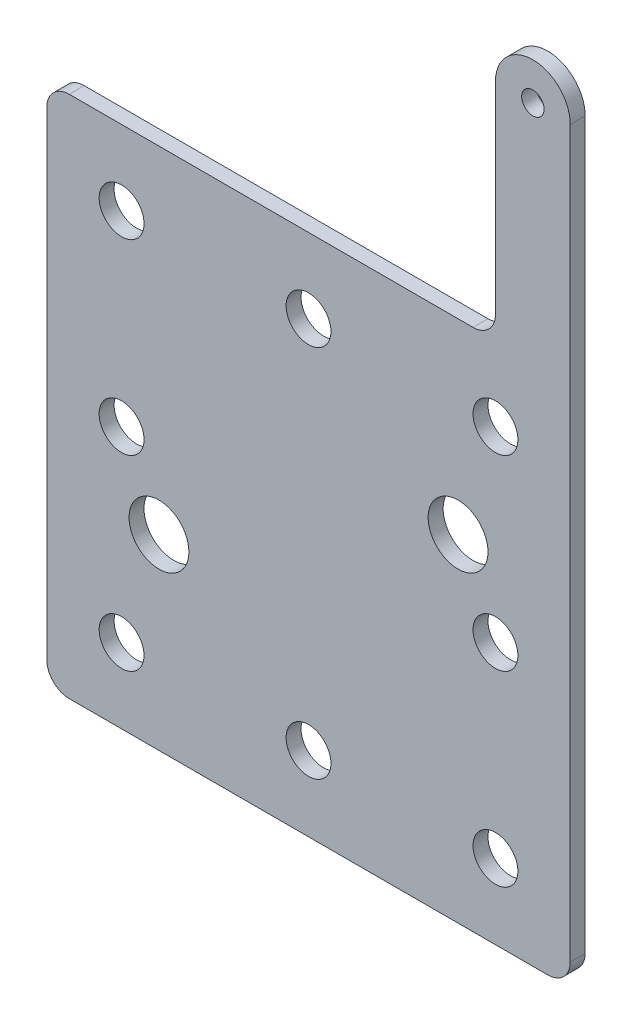
ISO-10303-21;
HEADER;
FILE_DESCRIPTION(('STEP AP214'),'2;1');
FILE_NAME('part.step','',(''),(''),'','','');
FILE_SCHEMA(('AUTOMOTIVE_DESIGN { 1 0 10303 214 1 1 1 1 }'));
ENDSEC;
DATA;
#1=APPLICATION_CONTEXT('core data for automotive mechanical design processes');
#2=APPLICATION_PROTOCOL_DEFINITION('international standard','automotive_design',2000,#1);
#3=PRODUCT_CONTEXT('',#1,'mechanical');
#4=PRODUCT('Part','Part','',(#3));
#5=PRODUCT_RELATED_PRODUCT_CATEGORY('part','',(#4));
#6=PRODUCT_DEFINITION_FORMATION('','',#4);
#7=PRODUCT_DEFINITION_CONTEXT('part definition',#1,'design');
#8=PRODUCT_DEFINITION('design','',#6,#7);
#9=PRODUCT_DEFINITION_SHAPE('','',#8);
#10=(LENGTH_UNIT() NAMED_UNIT(*) SI_UNIT(.MILLI.,.METRE.));
#11=(NAMED_UNIT(*) PLANE_ANGLE_UNIT() SI_UNIT($,.RADIAN.));
#12=(NAMED_UNIT(*) SI_UNIT($,.STERADIAN.) SOLID_ANGLE_UNIT());
#13=UNCERTAINTY_MEASURE_WITH_UNIT(LENGTH_MEASURE(1.E-05),#10,'distance_accuracy_value','');
#14=(GEOMETRIC_REPRESENTATION_CONTEXT(3) GLOBAL_UNCERTAINTY_ASSIGNED_CONTEXT((#13)) GLOBAL_UNIT_ASSIGNED_CONTEXT((#10,
#11,#12)) REPRESENTATION_CONTEXT('',''));
#15=CARTESIAN_POINT('',(0.,0.,0.));
#16=DIRECTION('',(0.,0.,1.));
#17=DIRECTION('',(1.,0.,0.));
#18=AXIS2_PLACEMENT_3D('',#15,#16,#17);
#19=CARTESIAN_POINT('',(35.,35.,2.));
#20=DIRECTION('',(-1.,0.,0.));
#21=DIRECTION('',(0.,-1.,0.));
#22=AXIS2_PLACEMENT_3D('',#19,#20,#21);
#23=PLANE('',#22);
#24=DIRECTION('',(0.,1.,0.));
#25=VECTOR('',#24,1.);
#26=CARTESIAN_POINT('',(35.,-35.,2.));
#27=LINE('',#26,#25);
#28=CARTESIAN_POINT('',(35.,-32.,2.));
#29=VERTEX_POINT('',#28);
#30=CARTESIAN_POINT('',(35.,65.,2.));
#31=VERTEX_POINT('',#30);
#32=EDGE_CURVE('E109',#29,#31,#27,.T.);
#33=ORIENTED_EDGE('',*,*,#32,.F.);
#34=DIRECTION('',(0.,0.,-1.));
#35=VECTOR('',#34,1.);
#36=CARTESIAN_POINT('',(35.,-32.,2.));
#37=LINE('',#36,#35);
#38=CARTESIAN_POINT('',(35.,-32.,0.));
#39=VERTEX_POINT('',#38);
#40=EDGE_CURVE('E200',#29,#39,#37,.T.);
#41=ORIENTED_EDGE('',*,*,#40,.T.);
#42=DIRECTION('',(0.,1.,0.));
#43=VECTOR('',#42,1.);
#44=CARTESIAN_POINT('',(35.,35.,0.));
#45=LINE('',#44,#43);
#46=CARTESIAN_POINT('',(35.,65.,0.));
#47=VERTEX_POINT('',#46);
#48=EDGE_CURVE('E127',#39,#47,#45,.T.);
#49=ORIENTED_EDGE('',*,*,#48,.T.);
#50=DIRECTION('',(0.,0.,-1.));
#51=VECTOR('',#50,1.);
#52=CARTESIAN_POINT('',(35.,65.,2.));
#53=LINE('',#52,#51);
#54=EDGE_CURVE('E125',#31,#47,#53,.T.);
#55=ORIENTED_EDGE('',*,*,#54,.F.);
#56=EDGE_LOOP('',(#33,#41,#49,#55));
#57=FACE_BOUND('',#56,.T.);
#58=ADVANCED_FACE('F33',(#57),#23,.F.);
#59=CARTESIAN_POINT('',(30.,65.,2.));
#60=DIRECTION('',(0.,0.,-1.));
#61=DIRECTION('',(-1.,0.,0.));
#62=AXIS2_PLACEMENT_3D('',#59,#60,#61);
#63=CYLINDRICAL_SURFACE('',#62,5.);
#64=CARTESIAN_POINT('',(30.,65.,0.));
#65=DIRECTION('',(0.,0.,1.));
#66=DIRECTION('',(-1.,0.,0.));
#67=AXIS2_PLACEMENT_3D('',#64,#65,#66);
#68=CIRCLE('',#67,5.);
#69=CARTESIAN_POINT('',(25.,65.,0.));
#70=VERTEX_POINT('',#69);
#71=EDGE_CURVE('E148',#47,#70,#68,.T.);
#72=ORIENTED_EDGE('',*,*,#71,.T.);
#73=DIRECTION('',(0.,0.,-1.));
#74=VECTOR('',#73,1.);
#75=CARTESIAN_POINT('',(25.,65.,2.));
#76=LINE('',#75,#74);
#77=CARTESIAN_POINT('',(25.,65.,2.));
#78=VERTEX_POINT('',#77);
#79=EDGE_CURVE('E131',#78,#70,#76,.T.);
#80=ORIENTED_EDGE('',*,*,#79,.F.);
#81=CARTESIAN_POINT('',(30.,65.,2.));
#82=DIRECTION('',(0.,0.,1.));
#83=DIRECTION('',(-1.,0.,0.));
#84=AXIS2_PLACEMENT_3D('',#81,#82,#83);
#85=CIRCLE('',#84,5.);
#86=EDGE_CURVE('E115',#31,#78,#85,.T.);
#87=ORIENTED_EDGE('',*,*,#86,.F.);
#88=ORIENTED_EDGE('',*,*,#54,.T.);
#89=EDGE_LOOP('',(#72,#80,#87,#88));
#90=FACE_BOUND('',#89,.T.);
#91=ADVANCED_FACE('F133',(#90),#63,.T.);
#92=CARTESIAN_POINT('',(25.,35.,2.));
#93=DIRECTION('',(1.,0.,0.));
#94=DIRECTION('',(0.,0.,-1.));
#95=AXIS2_PLACEMENT_3D('',#92,#93,#94);
#96=PLANE('',#95);
#97=DIRECTION('',(0.,-1.,0.));
#98=VECTOR('',#97,1.);
#99=CARTESIAN_POINT('',(25.,35.,0.));
#100=LINE('',#99,#98);
#101=CARTESIAN_POINT('',(25.,38.,0.));
#102=VERTEX_POINT('',#101);
#103=EDGE_CURVE('E151',#70,#102,#100,.T.);
#104=ORIENTED_EDGE('',*,*,#103,.T.);
#105=DIRECTION('',(0.,0.,-1.));
#106=VECTOR('',#105,1.);
#107=CARTESIAN_POINT('',(25.,38.,2.));
#108=LINE('',#107,#106);
#109=CARTESIAN_POINT('',(25.,38.,2.));
#110=VERTEX_POINT('',#109);
#111=EDGE_CURVE('E198',#102,#110,#108,.F.);
#112=ORIENTED_EDGE('',*,*,#111,.T.);
#113=DIRECTION('',(0.,-1.,0.));
#114=VECTOR('',#113,1.);
#115=CARTESIAN_POINT('',(25.,35.,2.));
#116=LINE('',#115,#114);
#117=EDGE_CURVE('E136',#78,#110,#116,.T.);
#118=ORIENTED_EDGE('',*,*,#117,.F.);
#119=ORIENTED_EDGE('',*,*,#79,.T.);
#120=EDGE_LOOP('',(#104,#112,#118,#119));
#121=FACE_BOUND('',#120,.T.);
#122=ADVANCED_FACE('F228',(#121),#96,.F.);
#123=CARTESIAN_POINT('',(-35.,35.,2.));
#124=DIRECTION('',(0.,-1.,0.));
#125=DIRECTION('',(0.,0.,-1.));
#126=AXIS2_PLACEMENT_3D('',#123,#124,#125);
#127=PLANE('',#126);
#128=DIRECTION('',(-1.,0.,0.));
#129=VECTOR('',#128,1.);
#130=CARTESIAN_POINT('',(-35.,35.,2.));
#131=LINE('',#130,#129);
#132=CARTESIAN_POINT('',(22.,35.,2.));
#133=VERTEX_POINT('',#132);
#134=CARTESIAN_POINT('',(-32.,35.,2.));
#135=VERTEX_POINT('',#134);
#136=EDGE_CURVE('E138',#133,#135,#131,.T.);
#137=ORIENTED_EDGE('',*,*,#136,.F.);
#138=DIRECTION('',(0.,0.,-1.));
#139=VECTOR('',#138,1.);
#140=CARTESIAN_POINT('',(22.,35.,0.));
#141=LINE('',#140,#139);
#142=CARTESIAN_POINT('',(22.,35.,0.));
#143=VERTEX_POINT('',#142);
#144=EDGE_CURVE('E195',#133,#143,#141,.T.);
#145=ORIENTED_EDGE('',*,*,#144,.T.);
#146=DIRECTION('',(-1.,0.,0.));
#147=VECTOR('',#146,1.);
#148=CARTESIAN_POINT('',(-35.,35.,0.));
#149=LINE('',#148,#147);
#150=CARTESIAN_POINT('',(-32.,35.,0.));
#151=VERTEX_POINT('',#150);
#152=EDGE_CURVE('E154',#143,#151,#149,.T.);
#153=ORIENTED_EDGE('',*,*,#152,.T.);
#154=DIRECTION('',(0.,0.,-1.));
#155=VECTOR('',#154,1.);
#156=CARTESIAN_POINT('',(-32.,35.,2.));
#157=LINE('',#156,#155);
#158=EDGE_CURVE('E130',#151,#135,#157,.F.);
#159=ORIENTED_EDGE('',*,*,#158,.T.);
#160=EDGE_LOOP('',(#137,#145,#153,#159));
#161=FACE_BOUND('',#160,.T.);
#162=ADVANCED_FACE('F233',(#161),#127,.F.);
#163=CARTESIAN_POINT('',(-35.,-35.,2.));
#164=DIRECTION('',(1.,0.,0.));
#165=DIRECTION('',(0.,0.,-1.));
#166=AXIS2_PLACEMENT_3D('',#163,#164,#165);
#167=PLANE('',#166);
#168=DIRECTION('',(0.,-1.,0.));
#169=VECTOR('',#168,1.);
#170=CARTESIAN_POINT('',(-35.,-35.,0.));
#171=LINE('',#170,#169);
#172=CARTESIAN_POINT('',(-35.,32.,0.));
#173=VERTEX_POINT('',#172);
#174=CARTESIAN_POINT('',(-35.,-32.,0.));
#175=VERTEX_POINT('',#174);
#176=EDGE_CURVE('E157',#173,#175,#171,.T.);
#177=ORIENTED_EDGE('',*,*,#176,.T.);
#178=DIRECTION('',(0.,0.,-1.));
#179=VECTOR('',#178,1.);
#180=CARTESIAN_POINT('',(-35.,-32.,2.));
#181=LINE('',#180,#179);
#182=CARTESIAN_POINT('',(-35.,-32.,2.));
#183=VERTEX_POINT('',#182);
#184=EDGE_CURVE('E48',#175,#183,#181,.F.);
#185=ORIENTED_EDGE('',*,*,#184,.T.);
#186=DIRECTION('',(0.,-1.,0.));
#187=VECTOR('',#186,1.);
#188=CARTESIAN_POINT('',(-35.,-35.,2.));
#189=LINE('',#188,#187);
#190=CARTESIAN_POINT('',(-35.,32.,2.));
#191=VERTEX_POINT('',#190);
#192=EDGE_CURVE('E143',#191,#183,#189,.T.);
#193=ORIENTED_EDGE('',*,*,#192,.F.);
#194=DIRECTION('',(0.,0.,-1.));
#195=VECTOR('',#194,1.);
#196=CARTESIAN_POINT('',(-35.,32.,2.));
#197=LINE('',#196,#195);
#198=EDGE_CURVE('E217',#191,#173,#197,.T.);
#199=ORIENTED_EDGE('',*,*,#198,.T.);
#200=EDGE_LOOP('',(#177,#185,#193,#199));
#201=FACE_BOUND('',#200,.T.);
#202=ADVANCED_FACE('F238',(#201),#167,.F.);
#203=CARTESIAN_POINT('',(-35.,-35.,2.));
#204=DIRECTION('',(0.,1.,0.));
#205=DIRECTION('',(0.,0.,1.));
#206=AXIS2_PLACEMENT_3D('',#203,#204,#205);
#207=PLANE('',#206);
#208=DIRECTION('',(1.,0.,0.));
#209=VECTOR('',#208,1.);
#210=CARTESIAN_POINT('',(-35.,-35.,0.));
#211=LINE('',#210,#209);
#212=CARTESIAN_POINT('',(-32.,-35.,0.));
#213=VERTEX_POINT('',#212);
#214=CARTESIAN_POINT('',(32.,-35.,0.));
#215=VERTEX_POINT('',#214);
#216=EDGE_CURVE('E122',#213,#215,#211,.T.);
#217=ORIENTED_EDGE('',*,*,#216,.T.);
#218=DIRECTION('',(0.,0.,-1.));
#219=VECTOR('',#218,1.);
#220=CARTESIAN_POINT('',(32.,-35.,2.));
#221=LINE('',#220,#219);
#222=CARTESIAN_POINT('',(32.,-35.,2.));
#223=VERTEX_POINT('',#222);
#224=EDGE_CURVE('E211',#215,#223,#221,.F.);
#225=ORIENTED_EDGE('',*,*,#224,.T.);
#226=DIRECTION('',(1.,0.,0.));
#227=VECTOR('',#226,1.);
#228=CARTESIAN_POINT('',(-35.,-35.,2.));
#229=LINE('',#228,#227);
#230=CARTESIAN_POINT('',(-32.,-35.,2.));
#231=VERTEX_POINT('',#230);
#232=EDGE_CURVE('E145',#231,#223,#229,.T.);
#233=ORIENTED_EDGE('',*,*,#232,.F.);
#234=DIRECTION('',(0.,0.,-1.));
#235=VECTOR('',#234,1.);
#236=CARTESIAN_POINT('',(-32.,-35.,2.));
#237=LINE('',#236,#235);
#238=EDGE_CURVE('E208',#231,#213,#237,.T.);
#239=ORIENTED_EDGE('',*,*,#238,.T.);
#240=EDGE_LOOP('',(#217,#225,#233,#239));
#241=FACE_BOUND('',#240,.T.);
#242=ADVANCED_FACE('F246',(#241),#207,.F.);
#243=CARTESIAN_POINT('',(30.,65.,2.));
#244=DIRECTION('',(0.,0.,-1.));
#245=DIRECTION('',(-1.,0.,0.));
#246=AXIS2_PLACEMENT_3D('',#243,#244,#245);
#247=PLANE('',#246);
#248=CARTESIAN_POINT('',(25.,25.,2.));
#249=DIRECTION('',(0.,0.,1.));
#250=DIRECTION('',(1.,0.,0.));
#251=AXIS2_PLACEMENT_3D('',#248,#249,#250);
#252=CIRCLE('',#251,3.);
#253=CARTESIAN_POINT('',(28.,25.,2.));
#254=VERTEX_POINT('',#253);
#255=EDGE_CURVE('E336',#254,#254,#252,.T.);
#256=ORIENTED_EDGE('',*,*,#255,.F.);
#257=EDGE_LOOP('',(#256));
#258=FACE_BOUND('',#257,.T.);
#259=CARTESIAN_POINT('',(25.,0.,2.));
#260=DIRECTION('',(0.,0.,1.));
#261=DIRECTION('',(1.,0.,0.));
#262=AXIS2_PLACEMENT_3D('',#259,#260,#261);
#263=CIRCLE('',#262,3.);
#264=CARTESIAN_POINT('',(28.,0.,2.));
#265=VERTEX_POINT('',#264);
#266=EDGE_CURVE('E339',#265,#265,#263,.T.);
#267=ORIENTED_EDGE('',*,*,#266,.F.);
#268=EDGE_LOOP('',(#267));
#269=FACE_BOUND('',#268,.T.);
#270=CARTESIAN_POINT('',(25.,-25.,2.));
#271=DIRECTION('',(0.,0.,1.));
#272=DIRECTION('',(1.,0.,0.));
#273=AXIS2_PLACEMENT_3D('',#270,#271,#272);
#274=CIRCLE('',#273,3.);
#275=CARTESIAN_POINT('',(28.,-25.,2.));
#276=VERTEX_POINT('',#275);
#277=EDGE_CURVE('E342',#276,#276,#274,.T.);
#278=ORIENTED_EDGE('',*,*,#277,.F.);
#279=EDGE_LOOP('',(#278));
#280=FACE_BOUND('',#279,.T.);
#281=CARTESIAN_POINT('',(0.,-25.,2.));
#282=DIRECTION('',(0.,0.,1.));
#283=DIRECTION('',(1.,0.,0.));
#284=AXIS2_PLACEMENT_3D('',#281,#282,#283);
#285=CIRCLE('',#284,3.);
#286=CARTESIAN_POINT('',(3.00000000000001,-25.,2.));
#287=VERTEX_POINT('',#286);
#288=EDGE_CURVE('E345',#287,#287,#285,.T.);
#289=ORIENTED_EDGE('',*,*,#288,.F.);
#290=EDGE_LOOP('',(#289));
#291=FACE_BOUND('',#290,.T.);
#292=CARTESIAN_POINT('',(-20.,-10.,2.));
#293=DIRECTION('',(0.,0.,1.));
#294=DIRECTION('',(1.,0.,0.));
#295=AXIS2_PLACEMENT_3D('',#292,#293,#294);
#296=CIRCLE('',#295,4.);
#297=CARTESIAN_POINT('',(-16.,-10.,2.));
#298=VERTEX_POINT('',#297);
#299=EDGE_CURVE('E330',#298,#298,#296,.T.);
#300=ORIENTED_EDGE('',*,*,#299,.F.);
#301=EDGE_LOOP('',(#300));
#302=FACE_BOUND('',#301,.T.);
#303=CARTESIAN_POINT('',(-25.,25.,2.));
#304=DIRECTION('',(0.,0.,1.));
#305=DIRECTION('',(1.,0.,0.));
#306=AXIS2_PLACEMENT_3D('',#303,#304,#305);
#307=CIRCLE('',#306,3.);
#308=CARTESIAN_POINT('',(-22.,25.,2.));
#309=VERTEX_POINT('',#308);
#310=EDGE_CURVE('E333',#309,#309,#307,.T.);
#311=ORIENTED_EDGE('',*,*,#310,.F.);
#312=EDGE_LOOP('',(#311));
#313=FACE_BOUND('',#312,.T.);
#314=CARTESIAN_POINT('',(-25.,0.,2.));
#315=DIRECTION('',(0.,0.,1.));
#316=DIRECTION('',(1.,0.,0.));
#317=AXIS2_PLACEMENT_3D('',#314,#315,#316);
#318=CIRCLE('',#317,3.);
#319=CARTESIAN_POINT('',(-22.,0.,2.));
#320=VERTEX_POINT('',#319);
#321=EDGE_CURVE('E350',#320,#320,#318,.T.);
#322=ORIENTED_EDGE('',*,*,#321,.F.);
#323=EDGE_LOOP('',(#322));
#324=FACE_BOUND('',#323,.T.);
#325=CARTESIAN_POINT('',(-25.,-25.,2.));
#326=DIRECTION('',(0.,0.,1.));
#327=DIRECTION('',(1.,0.,0.));
#328=AXIS2_PLACEMENT_3D('',#325,#326,#327);
#329=CIRCLE('',#328,3.);
#330=CARTESIAN_POINT('',(-22.,-25.,2.));
#331=VERTEX_POINT('',#330);
#332=EDGE_CURVE('E348',#331,#331,#329,.T.);
#333=ORIENTED_EDGE('',*,*,#332,.F.);
#334=EDGE_LOOP('',(#333));
#335=FACE_BOUND('',#334,.T.);
#336=CARTESIAN_POINT('',(20.,10.,2.));
#337=DIRECTION('',(0.,0.,1.));
#338=DIRECTION('',(1.,0.,0.));
#339=AXIS2_PLACEMENT_3D('',#336,#337,#338);
#340=CIRCLE('',#339,4.);
#341=CARTESIAN_POINT('',(24.,10.,2.));
#342=VERTEX_POINT('',#341);
#343=EDGE_CURVE('E328',#342,#342,#340,.T.);
#344=ORIENTED_EDGE('',*,*,#343,.F.);
#345=EDGE_LOOP('',(#344));
#346=FACE_BOUND('',#345,.T.);
#347=CARTESIAN_POINT('',(0.,25.,2.));
#348=DIRECTION('',(0.,0.,1.));
#349=DIRECTION('',(1.,0.,0.));
#350=AXIS2_PLACEMENT_3D('',#347,#348,#349);
#351=CIRCLE('',#350,3.);
#352=CARTESIAN_POINT('',(3.00000000000001,25.,2.));
#353=VERTEX_POINT('',#352);
#354=EDGE_CURVE('E166',#353,#353,#351,.T.);
#355=ORIENTED_EDGE('',*,*,#354,.F.);
#356=EDGE_LOOP('',(#355));
#357=FACE_BOUND('',#356,.T.);
#358=CARTESIAN_POINT('',(30.,65.,2.));
#359=DIRECTION('',(0.,0.,1.));
#360=DIRECTION('',(1.,0.,0.));
#361=AXIS2_PLACEMENT_3D('',#358,#359,#360);
#362=CIRCLE('',#361,1.5);
#363=CARTESIAN_POINT('',(31.5,65.,2.));
#364=VERTEX_POINT('',#363);
#365=EDGE_CURVE('E193',#364,#364,#362,.T.);
#366=ORIENTED_EDGE('',*,*,#365,.F.);
#367=EDGE_LOOP('',(#366));
#368=FACE_BOUND('',#367,.T.);
#369=ORIENTED_EDGE('',*,*,#232,.T.);
#370=CARTESIAN_POINT('',(32.,-32.,2.));
#371=DIRECTION('',(0.,0.,-1.));
#372=DIRECTION('',(-1.,0.,0.));
#373=AXIS2_PLACEMENT_3D('',#370,#371,#372);
#374=CIRCLE('',#373,3.);
#375=EDGE_CURVE('E118',#223,#29,#374,.F.);
#376=ORIENTED_EDGE('',*,*,#375,.T.);
#377=ORIENTED_EDGE('',*,*,#32,.T.);
#378=ORIENTED_EDGE('',*,*,#86,.T.);
#379=ORIENTED_EDGE('',*,*,#117,.T.);
#380=CARTESIAN_POINT('',(22.,38.,2.));
#381=DIRECTION('',(0.,0.,-1.));
#382=DIRECTION('',(-1.,0.,0.));
#383=AXIS2_PLACEMENT_3D('',#380,#381,#382);
#384=CIRCLE('',#383,3.);
#385=EDGE_CURVE('E11',#110,#133,#384,.T.);
#386=ORIENTED_EDGE('',*,*,#385,.T.);
#387=ORIENTED_EDGE('',*,*,#136,.T.);
#388=CARTESIAN_POINT('',(-32.,32.,2.));
#389=DIRECTION('',(0.,0.,-1.));
#390=DIRECTION('',(-1.,0.,0.));
#391=AXIS2_PLACEMENT_3D('',#388,#389,#390);
#392=CIRCLE('',#391,3.);
#393=EDGE_CURVE('E55',#135,#191,#392,.F.);
#394=ORIENTED_EDGE('',*,*,#393,.T.);
#395=ORIENTED_EDGE('',*,*,#192,.T.);
#396=CARTESIAN_POINT('',(-32.,-32.,2.));
#397=DIRECTION('',(0.,0.,-1.));
#398=DIRECTION('',(-1.,0.,0.));
#399=AXIS2_PLACEMENT_3D('',#396,#397,#398);
#400=CIRCLE('',#399,3.);
#401=EDGE_CURVE('E214',#183,#231,#400,.F.);
#402=ORIENTED_EDGE('',*,*,#401,.T.);
#403=EDGE_LOOP('',(#369,#376,#377,#378,#379,#386,#387,#394,#395,#402));
#404=FACE_BOUND('',#403,.T.);
#405=ADVANCED_FACE('F112',(#258,#269,#280,#291,#302,#313,#324,#335,#346,#357,#368,#404),#247,.F.);
#406=CARTESIAN_POINT('',(30.,65.,0.));
#407=DIRECTION('',(0.,0.,-1.));
#408=DIRECTION('',(-1.,0.,0.));
#409=AXIS2_PLACEMENT_3D('',#406,#407,#408);
#410=PLANE('',#409);
#411=CARTESIAN_POINT('',(25.,25.,0.));
#412=DIRECTION('',(0.,0.,-1.));
#413=DIRECTION('',(-1.,0.,0.));
#414=AXIS2_PLACEMENT_3D('',#411,#412,#413);
#415=CIRCLE('',#414,3.);
#416=CARTESIAN_POINT('',(22.,25.,0.));
#417=VERTEX_POINT('',#416);
#418=EDGE_CURVE('E190',#417,#417,#415,.T.);
#419=ORIENTED_EDGE('',*,*,#418,.F.);
#420=EDGE_LOOP('',(#419));
#421=FACE_BOUND('',#420,.T.);
#422=CARTESIAN_POINT('',(25.,0.,0.));
#423=DIRECTION('',(0.,0.,-1.));
#424=DIRECTION('',(-1.,0.,0.));
#425=AXIS2_PLACEMENT_3D('',#422,#423,#424);
#426=CIRCLE('',#425,3.);
#427=CARTESIAN_POINT('',(22.,0.,0.));
#428=VERTEX_POINT('',#427);
#429=EDGE_CURVE('E187',#428,#428,#426,.T.);
#430=ORIENTED_EDGE('',*,*,#429,.F.);
#431=EDGE_LOOP('',(#430));
#432=FACE_BOUND('',#431,.T.);
#433=CARTESIAN_POINT('',(25.,-25.,0.));
#434=DIRECTION('',(0.,0.,-1.));
#435=DIRECTION('',(-1.,0.,0.));
#436=AXIS2_PLACEMENT_3D('',#433,#434,#435);
#437=CIRCLE('',#436,3.);
#438=CARTESIAN_POINT('',(22.,-25.,0.));
#439=VERTEX_POINT('',#438);
#440=EDGE_CURVE('E184',#439,#439,#437,.T.);
#441=ORIENTED_EDGE('',*,*,#440,.F.);
#442=EDGE_LOOP('',(#441));
#443=FACE_BOUND('',#442,.T.);
#444=CARTESIAN_POINT('',(0.,-25.,0.));
#445=DIRECTION('',(0.,0.,-1.));
#446=DIRECTION('',(-1.,0.,0.));
#447=AXIS2_PLACEMENT_3D('',#444,#445,#446);
#448=CIRCLE('',#447,3.);
#449=CARTESIAN_POINT('',(-2.99999999999999,-25.,0.));
#450=VERTEX_POINT('',#449);
#451=EDGE_CURVE('E181',#450,#450,#448,.T.);
#452=ORIENTED_EDGE('',*,*,#451,.F.);
#453=EDGE_LOOP('',(#452));
#454=FACE_BOUND('',#453,.T.);
#455=CARTESIAN_POINT('',(-20.,-10.,0.));
#456=DIRECTION('',(0.,0.,-1.));
#457=DIRECTION('',(-1.,0.,0.));
#458=AXIS2_PLACEMENT_3D('',#455,#456,#457);
#459=CIRCLE('',#458,4.);
#460=CARTESIAN_POINT('',(-24.,-10.,0.));
#461=VERTEX_POINT('',#460);
#462=EDGE_CURVE('E178',#461,#461,#459,.T.);
#463=ORIENTED_EDGE('',*,*,#462,.F.);
#464=EDGE_LOOP('',(#463));
#465=FACE_BOUND('',#464,.T.);
#466=CARTESIAN_POINT('',(-25.,25.,0.));
#467=DIRECTION('',(0.,0.,-1.));
#468=DIRECTION('',(-1.,0.,0.));
#469=AXIS2_PLACEMENT_3D('',#466,#467,#468);
#470=CIRCLE('',#469,3.);
#471=CARTESIAN_POINT('',(-28.,25.,0.));
#472=VERTEX_POINT('',#471);
#473=EDGE_CURVE('E175',#472,#472,#470,.T.);
#474=ORIENTED_EDGE('',*,*,#473,.F.);
#475=EDGE_LOOP('',(#474));
#476=FACE_BOUND('',#475,.T.);
#477=CARTESIAN_POINT('',(-25.,0.,0.));
#478=DIRECTION('',(0.,0.,-1.));
#479=DIRECTION('',(-1.,0.,0.));
#480=AXIS2_PLACEMENT_3D('',#477,#478,#479);
#481=CIRCLE('',#480,3.);
#482=CARTESIAN_POINT('',(-28.,0.,0.));
#483=VERTEX_POINT('',#482);
#484=EDGE_CURVE('E172',#483,#483,#481,.T.);
#485=ORIENTED_EDGE('',*,*,#484,.F.);
#486=EDGE_LOOP('',(#485));
#487=FACE_BOUND('',#486,.T.);
#488=CARTESIAN_POINT('',(-25.,-25.,0.));
#489=DIRECTION('',(0.,0.,-1.));
#490=DIRECTION('',(-1.,0.,0.));
#491=AXIS2_PLACEMENT_3D('',#488,#489,#490);
#492=CIRCLE('',#491,3.);
#493=CARTESIAN_POINT('',(-28.,-25.,0.));
#494=VERTEX_POINT('',#493);
#495=EDGE_CURVE('E169',#494,#494,#492,.T.);
#496=ORIENTED_EDGE('',*,*,#495,.F.);
#497=EDGE_LOOP('',(#496));
#498=FACE_BOUND('',#497,.T.);
#499=CARTESIAN_POINT('',(20.,10.,0.));
#500=DIRECTION('',(0.,0.,-1.));
#501=DIRECTION('',(-1.,0.,0.));
#502=AXIS2_PLACEMENT_3D('',#499,#500,#501);
#503=CIRCLE('',#502,4.);
#504=CARTESIAN_POINT('',(16.,10.,0.));
#505=VERTEX_POINT('',#504);
#506=EDGE_CURVE('E165',#505,#505,#503,.T.);
#507=ORIENTED_EDGE('',*,*,#506,.F.);
#508=EDGE_LOOP('',(#507));
#509=FACE_BOUND('',#508,.T.);
#510=CARTESIAN_POINT('',(0.,25.,0.));
#511=DIRECTION('',(0.,0.,-1.));
#512=DIRECTION('',(-1.,0.,0.));
#513=AXIS2_PLACEMENT_3D('',#510,#511,#512);
#514=CIRCLE('',#513,3.);
#515=CARTESIAN_POINT('',(-2.99999999999999,25.,0.));
#516=VERTEX_POINT('',#515);
#517=EDGE_CURVE('E162',#516,#516,#514,.T.);
#518=ORIENTED_EDGE('',*,*,#517,.F.);
#519=EDGE_LOOP('',(#518));
#520=FACE_BOUND('',#519,.T.);
#521=CARTESIAN_POINT('',(30.,65.,0.));
#522=DIRECTION('',(0.,0.,1.));
#523=DIRECTION('',(1.,0.,0.));
#524=AXIS2_PLACEMENT_3D('',#521,#522,#523);
#525=CIRCLE('',#524,1.5);
#526=CARTESIAN_POINT('',(31.5,65.,0.));
#527=VERTEX_POINT('',#526);
#528=EDGE_CURVE('E149',#527,#527,#525,.T.);
#529=ORIENTED_EDGE('',*,*,#528,.T.);
#530=EDGE_LOOP('',(#529));
#531=FACE_BOUND('',#530,.T.);
#532=ORIENTED_EDGE('',*,*,#48,.F.);
#533=CARTESIAN_POINT('',(32.,-32.,0.));
#534=DIRECTION('',(0.,0.,-1.));
#535=DIRECTION('',(-1.,0.,0.));
#536=AXIS2_PLACEMENT_3D('',#533,#534,#535);
#537=CIRCLE('',#536,3.);
#538=EDGE_CURVE('E206',#39,#215,#537,.T.);
#539=ORIENTED_EDGE('',*,*,#538,.T.);
#540=ORIENTED_EDGE('',*,*,#216,.F.);
#541=CARTESIAN_POINT('',(-32.,-32.,0.));
#542=DIRECTION('',(0.,0.,-1.));
#543=DIRECTION('',(-1.,0.,0.));
#544=AXIS2_PLACEMENT_3D('',#541,#542,#543);
#545=CIRCLE('',#544,3.);
#546=EDGE_CURVE('E204',#213,#175,#545,.T.);
#547=ORIENTED_EDGE('',*,*,#546,.T.);
#548=ORIENTED_EDGE('',*,*,#176,.F.);
#549=CARTESIAN_POINT('',(-32.,32.,0.));
#550=DIRECTION('',(0.,0.,-1.));
#551=DIRECTION('',(-1.,0.,0.));
#552=AXIS2_PLACEMENT_3D('',#549,#550,#551);
#553=CIRCLE('',#552,3.);
#554=EDGE_CURVE('E202',#173,#151,#553,.T.);
#555=ORIENTED_EDGE('',*,*,#554,.T.);
#556=ORIENTED_EDGE('',*,*,#152,.F.);
#557=CARTESIAN_POINT('',(22.,38.,0.));
#558=DIRECTION('',(0.,0.,-1.));
#559=DIRECTION('',(-1.,0.,0.));
#560=AXIS2_PLACEMENT_3D('',#557,#558,#559);
#561=CIRCLE('',#560,3.);
#562=EDGE_CURVE('E41',#143,#102,#561,.F.);
#563=ORIENTED_EDGE('',*,*,#562,.T.);
#564=ORIENTED_EDGE('',*,*,#103,.F.);
#565=ORIENTED_EDGE('',*,*,#71,.F.);
#566=EDGE_LOOP('',(#532,#539,#540,#547,#548,#555,#556,#563,#564,#565));
#567=FACE_BOUND('',#566,.T.);
#568=ADVANCED_FACE('F223',(#421,#432,#443,#454,#465,#476,#487,#498,#509,#520,#531,#567),#410,.T.);
#569=CARTESIAN_POINT('',(30.,65.,0.));
#570=DIRECTION('',(0.,0.,1.));
#571=DIRECTION('',(1.,0.,0.));
#572=AXIS2_PLACEMENT_3D('',#569,#570,#571);
#573=CYLINDRICAL_SURFACE('',#572,1.5);
#574=ORIENTED_EDGE('',*,*,#528,.F.);
#575=EDGE_LOOP('',(#574));
#576=FACE_BOUND('',#575,.T.);
#577=ORIENTED_EDGE('',*,*,#365,.T.);
#578=EDGE_LOOP('',(#577));
#579=FACE_BOUND('',#578,.T.);
#580=ADVANCED_FACE('F276',(#576,#579),#573,.F.);
#581=CARTESIAN_POINT('',(0.,25.,-8.));
#582=DIRECTION('',(0.,0.,1.));
#583=DIRECTION('',(1.,0.,0.));
#584=AXIS2_PLACEMENT_3D('',#581,#582,#583);
#585=CYLINDRICAL_SURFACE('',#584,3.);
#586=ORIENTED_EDGE('',*,*,#517,.T.);
#587=EDGE_LOOP('',(#586));
#588=FACE_BOUND('',#587,.T.);
#589=ORIENTED_EDGE('',*,*,#354,.T.);
#590=EDGE_LOOP('',(#589));
#591=FACE_BOUND('',#590,.T.);
#592=ADVANCED_FACE('F283',(#588,#591),#585,.F.);
#593=CARTESIAN_POINT('',(20.,10.,-8.));
#594=DIRECTION('',(0.,0.,1.));
#595=DIRECTION('',(1.,0.,0.));
#596=AXIS2_PLACEMENT_3D('',#593,#594,#595);
#597=CYLINDRICAL_SURFACE('',#596,4.);
#598=ORIENTED_EDGE('',*,*,#506,.T.);
#599=EDGE_LOOP('',(#598));
#600=FACE_BOUND('',#599,.T.);
#601=ORIENTED_EDGE('',*,*,#343,.T.);
#602=EDGE_LOOP('',(#601));
#603=FACE_BOUND('',#602,.T.);
#604=ADVANCED_FACE('F287',(#600,#603),#597,.F.);
#605=CARTESIAN_POINT('',(-25.,-25.,-8.));
#606=DIRECTION('',(0.,0.,1.));
#607=DIRECTION('',(1.,0.,0.));
#608=AXIS2_PLACEMENT_3D('',#605,#606,#607);
#609=CYLINDRICAL_SURFACE('',#608,3.);
#610=ORIENTED_EDGE('',*,*,#495,.T.);
#611=EDGE_LOOP('',(#610));
#612=FACE_BOUND('',#611,.T.);
#613=ORIENTED_EDGE('',*,*,#332,.T.);
#614=EDGE_LOOP('',(#613));
#615=FACE_BOUND('',#614,.T.);
#616=ADVANCED_FACE('F293',(#612,#615),#609,.F.);
#617=CARTESIAN_POINT('',(-25.,0.,-8.));
#618=DIRECTION('',(0.,0.,1.));
#619=DIRECTION('',(1.,0.,0.));
#620=AXIS2_PLACEMENT_3D('',#617,#618,#619);
#621=CYLINDRICAL_SURFACE('',#620,3.);
#622=ORIENTED_EDGE('',*,*,#484,.T.);
#623=EDGE_LOOP('',(#622));
#624=FACE_BOUND('',#623,.T.);
#625=ORIENTED_EDGE('',*,*,#321,.T.);
#626=EDGE_LOOP('',(#625));
#627=FACE_BOUND('',#626,.T.);
#628=ADVANCED_FACE('F289',(#624,#627),#621,.F.);
#629=CARTESIAN_POINT('',(-25.,25.,-8.));
#630=DIRECTION('',(0.,0.,1.));
#631=DIRECTION('',(1.,0.,0.));
#632=AXIS2_PLACEMENT_3D('',#629,#630,#631);
#633=CYLINDRICAL_SURFACE('',#632,3.);
#634=ORIENTED_EDGE('',*,*,#473,.T.);
#635=EDGE_LOOP('',(#634));
#636=FACE_BOUND('',#635,.T.);
#637=ORIENTED_EDGE('',*,*,#310,.T.);
#638=EDGE_LOOP('',(#637));
#639=FACE_BOUND('',#638,.T.);
#640=ADVANCED_FACE('F292',(#636,#639),#633,.F.);
#641=CARTESIAN_POINT('',(-20.,-10.,-8.));
#642=DIRECTION('',(0.,0.,1.));
#643=DIRECTION('',(1.,0.,0.));
#644=AXIS2_PLACEMENT_3D('',#641,#642,#643);
#645=CYLINDRICAL_SURFACE('',#644,4.);
#646=ORIENTED_EDGE('',*,*,#462,.T.);
#647=EDGE_LOOP('',(#646));
#648=FACE_BOUND('',#647,.T.);
#649=ORIENTED_EDGE('',*,*,#299,.T.);
#650=EDGE_LOOP('',(#649));
#651=FACE_BOUND('',#650,.T.);
#652=ADVANCED_FACE('F298',(#648,#651),#645,.F.);
#653=CARTESIAN_POINT('',(0.,-25.,-8.));
#654=DIRECTION('',(0.,0.,1.));
#655=DIRECTION('',(1.,0.,0.));
#656=AXIS2_PLACEMENT_3D('',#653,#654,#655);
#657=CYLINDRICAL_SURFACE('',#656,3.);
#658=ORIENTED_EDGE('',*,*,#451,.T.);
#659=EDGE_LOOP('',(#658));
#660=FACE_BOUND('',#659,.T.);
#661=ORIENTED_EDGE('',*,*,#288,.T.);
#662=EDGE_LOOP('',(#661));
#663=FACE_BOUND('',#662,.T.);
#664=ADVANCED_FACE('F301',(#660,#663),#657,.F.);
#665=CARTESIAN_POINT('',(25.,-25.,-8.));
#666=DIRECTION('',(0.,0.,1.));
#667=DIRECTION('',(1.,0.,0.));
#668=AXIS2_PLACEMENT_3D('',#665,#666,#667);
#669=CYLINDRICAL_SURFACE('',#668,3.);
#670=ORIENTED_EDGE('',*,*,#440,.T.);
#671=EDGE_LOOP('',(#670));
#672=FACE_BOUND('',#671,.T.);
#673=ORIENTED_EDGE('',*,*,#277,.T.);
#674=EDGE_LOOP('',(#673));
#675=FACE_BOUND('',#674,.T.);
#676=ADVANCED_FACE('F308',(#672,#675),#669,.F.);
#677=CARTESIAN_POINT('',(25.,0.,-8.));
#678=DIRECTION('',(0.,0.,1.));
#679=DIRECTION('',(1.,0.,0.));
#680=AXIS2_PLACEMENT_3D('',#677,#678,#679);
#681=CYLINDRICAL_SURFACE('',#680,3.);
#682=ORIENTED_EDGE('',*,*,#429,.T.);
#683=EDGE_LOOP('',(#682));
#684=FACE_BOUND('',#683,.T.);
#685=ORIENTED_EDGE('',*,*,#266,.T.);
#686=EDGE_LOOP('',(#685));
#687=FACE_BOUND('',#686,.T.);
#688=ADVANCED_FACE('F312',(#684,#687),#681,.F.);
#689=CARTESIAN_POINT('',(25.,25.,-8.));
#690=DIRECTION('',(0.,0.,1.));
#691=DIRECTION('',(1.,0.,0.));
#692=AXIS2_PLACEMENT_3D('',#689,#690,#691);
#693=CYLINDRICAL_SURFACE('',#692,3.);
#694=ORIENTED_EDGE('',*,*,#418,.T.);
#695=EDGE_LOOP('',(#694));
#696=FACE_BOUND('',#695,.T.);
#697=ORIENTED_EDGE('',*,*,#255,.T.);
#698=EDGE_LOOP('',(#697));
#699=FACE_BOUND('',#698,.T.);
#700=ADVANCED_FACE('F256',(#696,#699),#693,.F.);
#701=CARTESIAN_POINT('',(22.,38.,2.));
#702=DIRECTION('',(0.,0.,1.));
#703=DIRECTION('',(1.,0.,0.));
#704=AXIS2_PLACEMENT_3D('',#701,#702,#703);
#705=CYLINDRICAL_SURFACE('',#704,3.);
#706=ORIENTED_EDGE('',*,*,#385,.F.);
#707=ORIENTED_EDGE('',*,*,#111,.F.);
#708=ORIENTED_EDGE('',*,*,#562,.F.);
#709=ORIENTED_EDGE('',*,*,#144,.F.);
#710=EDGE_LOOP('',(#706,#707,#708,#709));
#711=FACE_BOUND('',#710,.T.);
#712=ADVANCED_FACE('F230',(#711),#705,.F.);
#713=CARTESIAN_POINT('',(32.,-32.,2.));
#714=DIRECTION('',(0.,0.,-1.));
#715=DIRECTION('',(-1.,0.,0.));
#716=AXIS2_PLACEMENT_3D('',#713,#714,#715);
#717=CYLINDRICAL_SURFACE('',#716,3.);
#718=ORIENTED_EDGE('',*,*,#375,.F.);
#719=ORIENTED_EDGE('',*,*,#224,.F.);
#720=ORIENTED_EDGE('',*,*,#538,.F.);
#721=ORIENTED_EDGE('',*,*,#40,.F.);
#722=EDGE_LOOP('',(#718,#719,#720,#721));
#723=FACE_BOUND('',#722,.T.);
#724=ADVANCED_FACE('F249',(#723),#717,.T.);
#725=CARTESIAN_POINT('',(-32.,-32.,2.));
#726=DIRECTION('',(0.,0.,-1.));
#727=DIRECTION('',(-1.,0.,0.));
#728=AXIS2_PLACEMENT_3D('',#725,#726,#727);
#729=CYLINDRICAL_SURFACE('',#728,3.);
#730=ORIENTED_EDGE('',*,*,#401,.F.);
#731=ORIENTED_EDGE('',*,*,#184,.F.);
#732=ORIENTED_EDGE('',*,*,#546,.F.);
#733=ORIENTED_EDGE('',*,*,#238,.F.);
#734=EDGE_LOOP('',(#730,#731,#732,#733));
#735=FACE_BOUND('',#734,.T.);
#736=ADVANCED_FACE('F243',(#735),#729,.T.);
#737=CARTESIAN_POINT('',(-32.,32.,2.));
#738=DIRECTION('',(0.,0.,-1.));
#739=DIRECTION('',(-1.,0.,0.));
#740=AXIS2_PLACEMENT_3D('',#737,#738,#739);
#741=CYLINDRICAL_SURFACE('',#740,3.);
#742=ORIENTED_EDGE('',*,*,#393,.F.);
#743=ORIENTED_EDGE('',*,*,#158,.F.);
#744=ORIENTED_EDGE('',*,*,#554,.F.);
#745=ORIENTED_EDGE('',*,*,#198,.F.);
#746=EDGE_LOOP('',(#742,#743,#744,#745));
#747=FACE_BOUND('',#746,.T.);
#748=ADVANCED_FACE('F35',(#747),#741,.T.);
#749=CLOSED_SHELL('',(#58,#91,#122,#162,#202,#242,#405,#568,#580,#592,#604,#616,#628,#640,#652,
#664,#676,#688,#700,#712,#724,#736,#748));
#750=MANIFOLD_SOLID_BREP('B2',#749);
#751=ADVANCED_BREP_SHAPE_REPRESENTATION('',(#18,#750),#14);
#752=SHAPE_DEFINITION_REPRESENTATION(#9,#751);
ENDSEC;
END-ISO-10303-21;
